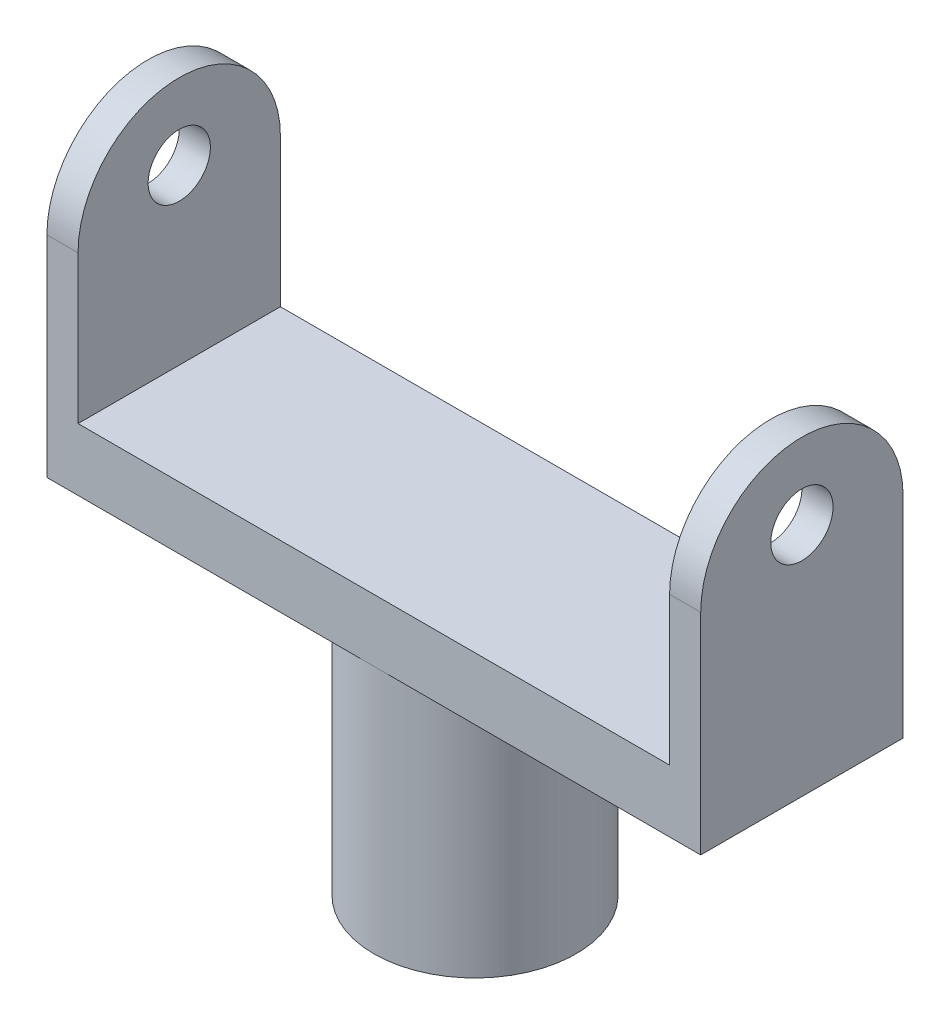
ISO-10303-21;
HEADER;
FILE_DESCRIPTION(('STEP AP214'),'2;1');
FILE_NAME('part.step','',(''),(''),'','','');
FILE_SCHEMA(('AUTOMOTIVE_DESIGN { 1 0 10303 214 1 1 1 1 }'));
ENDSEC;
DATA;
#1=APPLICATION_CONTEXT('core data for automotive mechanical design processes');
#2=APPLICATION_PROTOCOL_DEFINITION('international standard','automotive_design',2000,#1);
#3=PRODUCT_CONTEXT('',#1,'mechanical');
#4=PRODUCT('Part','Part','',(#3));
#5=PRODUCT_RELATED_PRODUCT_CATEGORY('part','',(#4));
#6=PRODUCT_DEFINITION_FORMATION('','',#4);
#7=PRODUCT_DEFINITION_CONTEXT('part definition',#1,'design');
#8=PRODUCT_DEFINITION('design','',#6,#7);
#9=PRODUCT_DEFINITION_SHAPE('','',#8);
#10=(LENGTH_UNIT() NAMED_UNIT(*) SI_UNIT(.MILLI.,.METRE.));
#11=(NAMED_UNIT(*) PLANE_ANGLE_UNIT() SI_UNIT($,.RADIAN.));
#12=(NAMED_UNIT(*) SI_UNIT($,.STERADIAN.) SOLID_ANGLE_UNIT());
#13=UNCERTAINTY_MEASURE_WITH_UNIT(LENGTH_MEASURE(1.E-05),#10,'distance_accuracy_value','');
#14=(GEOMETRIC_REPRESENTATION_CONTEXT(3) GLOBAL_UNCERTAINTY_ASSIGNED_CONTEXT((#13)) GLOBAL_UNIT_ASSIGNED_CONTEXT((#10,
#11,#12)) REPRESENTATION_CONTEXT('',''));
#15=CARTESIAN_POINT('',(0.,0.,0.));
#16=DIRECTION('',(0.,0.,1.));
#17=DIRECTION('',(1.,0.,0.));
#18=AXIS2_PLACEMENT_3D('',#15,#16,#17);
#19=CARTESIAN_POINT('',(-9.5,14.75,0.));
#20=DIRECTION('',(1.,0.,0.));
#21=DIRECTION('',(0.,0.,-1.));
#22=AXIS2_PLACEMENT_3D('',#19,#20,#21);
#23=CYLINDRICAL_SURFACE('',#22,3.25);
#24=DIRECTION('',(-1.,0.,0.));
#25=VECTOR('',#24,1.);
#26=CARTESIAN_POINT('',(-9.5,14.75,3.25));
#27=LINE('',#26,#25);
#28=CARTESIAN_POINT('',(-9.5,14.75,3.25));
#29=VERTEX_POINT('',#28);
#30=CARTESIAN_POINT('',(-10.5,14.75,3.25));
#31=VERTEX_POINT('',#30);
#32=EDGE_CURVE('E200',#29,#31,#27,.T.);
#33=ORIENTED_EDGE('',*,*,#32,.F.);
#34=CARTESIAN_POINT('',(-9.5,14.75,0.));
#35=DIRECTION('',(-1.,0.,0.));
#36=DIRECTION('',(0.,0.,1.));
#37=AXIS2_PLACEMENT_3D('',#34,#35,#36);
#38=CIRCLE('',#37,3.25);
#39=CARTESIAN_POINT('',(-9.5,14.75,-3.25));
#40=VERTEX_POINT('',#39);
#41=EDGE_CURVE('E59',#40,#29,#38,.F.);
#42=ORIENTED_EDGE('',*,*,#41,.F.);
#43=DIRECTION('',(-1.,0.,0.));
#44=VECTOR('',#43,1.);
#45=CARTESIAN_POINT('',(-9.5,14.75,-3.25));
#46=LINE('',#45,#44);
#47=CARTESIAN_POINT('',(-10.5,14.75,-3.25));
#48=VERTEX_POINT('',#47);
#49=EDGE_CURVE('E125',#48,#40,#46,.F.);
#50=ORIENTED_EDGE('',*,*,#49,.F.);
#51=CARTESIAN_POINT('',(-10.5,14.75,0.));
#52=DIRECTION('',(1.,0.,0.));
#53=DIRECTION('',(0.,0.,-1.));
#54=AXIS2_PLACEMENT_3D('',#51,#52,#53);
#55=CIRCLE('',#54,3.25);
#56=EDGE_CURVE('E11',#31,#48,#55,.F.);
#57=ORIENTED_EDGE('',*,*,#56,.F.);
#58=EDGE_LOOP('',(#33,#42,#50,#57));
#59=FACE_BOUND('',#58,.T.);
#60=ADVANCED_FACE('F51',(#59),#23,.T.);
#61=CARTESIAN_POINT('',(10.5,14.75,0.));
#62=DIRECTION('',(1.,0.,0.));
#63=DIRECTION('',(0.,0.,-1.));
#64=AXIS2_PLACEMENT_3D('',#61,#62,#63);
#65=CYLINDRICAL_SURFACE('',#64,3.25);
#66=DIRECTION('',(1.,0.,0.));
#67=VECTOR('',#66,1.);
#68=CARTESIAN_POINT('',(-10.5,14.75,3.25));
#69=LINE('',#68,#67);
#70=CARTESIAN_POINT('',(10.5,14.75,3.25));
#71=VERTEX_POINT('',#70);
#72=CARTESIAN_POINT('',(9.5,14.75,3.25));
#73=VERTEX_POINT('',#72);
#74=EDGE_CURVE('E182',#71,#73,#69,.F.);
#75=ORIENTED_EDGE('',*,*,#74,.F.);
#76=CARTESIAN_POINT('',(10.5,14.75,0.));
#77=DIRECTION('',(-1.,0.,0.));
#78=DIRECTION('',(0.,0.,1.));
#79=AXIS2_PLACEMENT_3D('',#76,#77,#78);
#80=CIRCLE('',#79,3.25);
#81=CARTESIAN_POINT('',(10.5,14.75,-3.25));
#82=VERTEX_POINT('',#81);
#83=EDGE_CURVE('E196',#82,#71,#80,.F.);
#84=ORIENTED_EDGE('',*,*,#83,.F.);
#85=DIRECTION('',(1.,0.,0.));
#86=VECTOR('',#85,1.);
#87=CARTESIAN_POINT('',(-10.5,14.75,-3.25));
#88=LINE('',#87,#86);
#89=CARTESIAN_POINT('',(9.5,14.75,-3.25));
#90=VERTEX_POINT('',#89);
#91=EDGE_CURVE('E193',#90,#82,#88,.T.);
#92=ORIENTED_EDGE('',*,*,#91,.F.);
#93=CARTESIAN_POINT('',(9.5,14.75,0.));
#94=DIRECTION('',(1.,0.,0.));
#95=DIRECTION('',(0.,0.,-1.));
#96=AXIS2_PLACEMENT_3D('',#93,#94,#95);
#97=CIRCLE('',#96,3.25);
#98=EDGE_CURVE('E198',#73,#90,#97,.F.);
#99=ORIENTED_EDGE('',*,*,#98,.F.);
#100=EDGE_LOOP('',(#75,#84,#92,#99));
#101=FACE_BOUND('',#100,.T.);
#102=ADVANCED_FACE('F239',(#101),#65,.T.);
#103=CARTESIAN_POINT('',(0.,10.,0.));
#104=DIRECTION('',(0.,1.,0.));
#105=DIRECTION('',(0.,0.,1.));
#106=AXIS2_PLACEMENT_3D('',#103,#104,#105);
#107=PLANE('',#106);
#108=DIRECTION('',(1.,0.,0.));
#109=VECTOR('',#108,1.);
#110=CARTESIAN_POINT('',(-10.5,10.,3.25));
#111=LINE('',#110,#109);
#112=CARTESIAN_POINT('',(-9.5,10.,3.25));
#113=VERTEX_POINT('',#112);
#114=CARTESIAN_POINT('',(9.5,10.,3.25));
#115=VERTEX_POINT('',#114);
#116=EDGE_CURVE('E139',#113,#115,#111,.T.);
#117=ORIENTED_EDGE('',*,*,#116,.T.);
#118=DIRECTION('',(0.,0.,1.));
#119=VECTOR('',#118,1.);
#120=CARTESIAN_POINT('',(9.5,10.,-3.25));
#121=LINE('',#120,#119);
#122=CARTESIAN_POINT('',(9.5,10.,-3.25));
#123=VERTEX_POINT('',#122);
#124=EDGE_CURVE('E138',#123,#115,#121,.T.);
#125=ORIENTED_EDGE('',*,*,#124,.F.);
#126=DIRECTION('',(-1.,0.,0.));
#127=VECTOR('',#126,1.);
#128=CARTESIAN_POINT('',(-10.5,10.,-3.25));
#129=LINE('',#128,#127);
#130=CARTESIAN_POINT('',(-9.5,10.,-3.25));
#131=VERTEX_POINT('',#130);
#132=EDGE_CURVE('E124',#123,#131,#129,.T.);
#133=ORIENTED_EDGE('',*,*,#132,.T.);
#134=DIRECTION('',(0.,0.,-1.));
#135=VECTOR('',#134,1.);
#136=CARTESIAN_POINT('',(-9.5,10.,-3.25));
#137=LINE('',#136,#135);
#138=EDGE_CURVE('E129',#113,#131,#137,.T.);
#139=ORIENTED_EDGE('',*,*,#138,.F.);
#140=EDGE_LOOP('',(#117,#125,#133,#139));
#141=FACE_BOUND('',#140,.T.);
#142=ADVANCED_FACE('F135',(#141),#107,.T.);
#143=CARTESIAN_POINT('',(0.,0.,0.));
#144=DIRECTION('',(0.,1.,0.));
#145=DIRECTION('',(0.,0.,1.));
#146=AXIS2_PLACEMENT_3D('',#143,#144,#145);
#147=PLANE('',#146);
#148=CARTESIAN_POINT('',(0.,0.,0.));
#149=DIRECTION('',(0.,1.,0.));
#150=DIRECTION('',(0.,0.,1.));
#151=AXIS2_PLACEMENT_3D('',#148,#149,#150);
#152=CIRCLE('',#151,3.25);
#153=CARTESIAN_POINT('',(0.,0.,3.25));
#154=VERTEX_POINT('',#153);
#155=EDGE_CURVE('E178',#154,#154,#152,.T.);
#156=ORIENTED_EDGE('',*,*,#155,.F.);
#157=EDGE_LOOP('',(#156));
#158=FACE_BOUND('',#157,.T.);
#159=CARTESIAN_POINT('',(0.,0.,0.));
#160=DIRECTION('',(0.,1.,0.));
#161=DIRECTION('',(0.,0.,1.));
#162=AXIS2_PLACEMENT_3D('',#159,#160,#161);
#163=CIRCLE('',#162,2.75);
#164=CARTESIAN_POINT('',(0.,0.,2.75));
#165=VERTEX_POINT('',#164);
#166=EDGE_CURVE('E175',#165,#165,#163,.T.);
#167=ORIENTED_EDGE('',*,*,#166,.T.);
#168=EDGE_LOOP('',(#167));
#169=FACE_BOUND('',#168,.T.);
#170=ADVANCED_FACE('F249',(#158,#169),#147,.F.);
#171=CARTESIAN_POINT('',(0.,8.,0.));
#172=DIRECTION('',(0.,-1.,0.));
#173=DIRECTION('',(0.,0.,-1.));
#174=AXIS2_PLACEMENT_3D('',#171,#172,#173);
#175=CYLINDRICAL_SURFACE('',#174,3.25);
#176=CARTESIAN_POINT('',(0.,8.,0.));
#177=DIRECTION('',(0.,1.,0.));
#178=DIRECTION('',(0.,0.,1.));
#179=AXIS2_PLACEMENT_3D('',#176,#177,#178);
#180=CIRCLE('',#179,3.25);
#181=CARTESIAN_POINT('',(0.,8.,3.25));
#182=VERTEX_POINT('',#181);
#183=CARTESIAN_POINT('',(0.,8.,-3.25));
#184=VERTEX_POINT('',#183);
#185=EDGE_CURVE('E179',#182,#184,#180,.T.);
#186=ORIENTED_EDGE('',*,*,#185,.F.);
#187=EDGE_CURVE('E183',#184,#182,#180,.T.);
#188=ORIENTED_EDGE('',*,*,#187,.F.);
#189=EDGE_LOOP('',(#186,#188));
#190=FACE_BOUND('',#189,.T.);
#191=ORIENTED_EDGE('',*,*,#155,.T.);
#192=EDGE_LOOP('',(#191));
#193=FACE_BOUND('',#192,.T.);
#194=ADVANCED_FACE('F256',(#190,#193),#175,.T.);
#195=CARTESIAN_POINT('',(0.,8.,0.));
#196=DIRECTION('',(0.,-1.,0.));
#197=DIRECTION('',(0.,0.,-1.));
#198=AXIS2_PLACEMENT_3D('',#195,#196,#197);
#199=CYLINDRICAL_SURFACE('',#198,2.75);
#200=CARTESIAN_POINT('',(0.,8.,0.));
#201=DIRECTION('',(0.,1.,0.));
#202=DIRECTION('',(0.,0.,1.));
#203=AXIS2_PLACEMENT_3D('',#200,#201,#202);
#204=CIRCLE('',#203,2.75);
#205=CARTESIAN_POINT('',(0.,8.,2.75));
#206=VERTEX_POINT('',#205);
#207=EDGE_CURVE('E172',#206,#206,#204,.T.);
#208=ORIENTED_EDGE('',*,*,#207,.T.);
#209=EDGE_LOOP('',(#208));
#210=FACE_BOUND('',#209,.T.);
#211=ORIENTED_EDGE('',*,*,#166,.F.);
#212=EDGE_LOOP('',(#211));
#213=FACE_BOUND('',#212,.T.);
#214=ADVANCED_FACE('F259',(#210,#213),#199,.F.);
#215=CARTESIAN_POINT('',(0.,8.,0.));
#216=DIRECTION('',(0.,1.,0.));
#217=DIRECTION('',(0.,0.,1.));
#218=AXIS2_PLACEMENT_3D('',#215,#216,#217);
#219=PLANE('',#218);
#220=ORIENTED_EDGE('',*,*,#207,.F.);
#221=EDGE_LOOP('',(#220));
#222=FACE_BOUND('',#221,.T.);
#223=ADVANCED_FACE('F266',(#222),#219,.F.);
#224=DIRECTION('',(1.,0.,0.));
#225=VECTOR('',#224,1.);
#226=CARTESIAN_POINT('',(-10.5,8.,3.25));
#227=LINE('',#226,#225);
#228=CARTESIAN_POINT('',(10.5,8.,3.25));
#229=VERTEX_POINT('',#228);
#230=EDGE_CURVE('E162',#182,#229,#227,.T.);
#231=ORIENTED_EDGE('',*,*,#230,.F.);
#232=ORIENTED_EDGE('',*,*,#185,.T.);
#233=DIRECTION('',(-1.,0.,0.));
#234=VECTOR('',#233,1.);
#235=CARTESIAN_POINT('',(-10.5,8.,-3.25));
#236=LINE('',#235,#234);
#237=CARTESIAN_POINT('',(10.5,8.,-3.25));
#238=VERTEX_POINT('',#237);
#239=EDGE_CURVE('E156',#238,#184,#236,.T.);
#240=ORIENTED_EDGE('',*,*,#239,.F.);
#241=DIRECTION('',(0.,0.,-1.));
#242=VECTOR('',#241,1.);
#243=CARTESIAN_POINT('',(10.5,8.,-3.25));
#244=LINE('',#243,#242);
#245=EDGE_CURVE('E149',#229,#238,#244,.T.);
#246=ORIENTED_EDGE('',*,*,#245,.F.);
#247=EDGE_LOOP('',(#231,#232,#240,#246));
#248=FACE_BOUND('',#247,.T.);
#249=ADVANCED_FACE('F278',(#248),#219,.F.);
#250=CARTESIAN_POINT('',(-10.5,8.,-3.25));
#251=VERTEX_POINT('',#250);
#252=EDGE_CURVE('E155',#184,#251,#236,.T.);
#253=ORIENTED_EDGE('',*,*,#252,.F.);
#254=ORIENTED_EDGE('',*,*,#187,.T.);
#255=CARTESIAN_POINT('',(-10.5,8.,3.25));
#256=VERTEX_POINT('',#255);
#257=EDGE_CURVE('E140',#256,#182,#227,.T.);
#258=ORIENTED_EDGE('',*,*,#257,.F.);
#259=DIRECTION('',(0.,0.,1.));
#260=VECTOR('',#259,1.);
#261=CARTESIAN_POINT('',(-10.5,8.,-3.25));
#262=LINE('',#261,#260);
#263=EDGE_CURVE('E159',#251,#256,#262,.T.);
#264=ORIENTED_EDGE('',*,*,#263,.F.);
#265=EDGE_LOOP('',(#253,#254,#258,#264));
#266=FACE_BOUND('',#265,.T.);
#267=ADVANCED_FACE('F269',(#266),#219,.F.);
#268=CARTESIAN_POINT('',(10.5,10.,-3.25));
#269=DIRECTION('',(-1.,0.,0.));
#270=DIRECTION('',(0.,0.,1.));
#271=AXIS2_PLACEMENT_3D('',#268,#269,#270);
#272=PLANE('',#271);
#273=CARTESIAN_POINT('',(10.5,15.56,0.));
#274=DIRECTION('',(-1.,0.,0.));
#275=DIRECTION('',(0.,0.,1.));
#276=AXIS2_PLACEMENT_3D('',#273,#274,#275);
#277=CIRCLE('',#276,1.);
#278=CARTESIAN_POINT('',(10.5,15.56,1.));
#279=VERTEX_POINT('',#278);
#280=EDGE_CURVE('E190',#279,#279,#277,.T.);
#281=ORIENTED_EDGE('',*,*,#280,.T.);
#282=EDGE_LOOP('',(#281));
#283=FACE_BOUND('',#282,.T.);
#284=DIRECTION('',(0.,-1.,0.));
#285=VECTOR('',#284,1.);
#286=CARTESIAN_POINT('',(10.5,10.,-3.25));
#287=LINE('',#286,#285);
#288=EDGE_CURVE('E170',#82,#238,#287,.T.);
#289=ORIENTED_EDGE('',*,*,#288,.F.);
#290=ORIENTED_EDGE('',*,*,#83,.T.);
#291=DIRECTION('',(0.,-1.,0.));
#292=VECTOR('',#291,1.);
#293=CARTESIAN_POINT('',(10.5,10.,3.25));
#294=LINE('',#293,#292);
#295=EDGE_CURVE('E152',#71,#229,#294,.T.);
#296=ORIENTED_EDGE('',*,*,#295,.T.);
#297=ORIENTED_EDGE('',*,*,#245,.T.);
#298=EDGE_LOOP('',(#289,#290,#296,#297));
#299=FACE_BOUND('',#298,.T.);
#300=ADVANCED_FACE('F220',(#283,#299),#272,.F.);
#301=CARTESIAN_POINT('',(-10.5,10.,-3.25));
#302=DIRECTION('',(0.,0.,1.));
#303=DIRECTION('',(1.,0.,0.));
#304=AXIS2_PLACEMENT_3D('',#301,#302,#303);
#305=PLANE('',#304);
#306=DIRECTION('',(0.,-1.,0.));
#307=VECTOR('',#306,1.);
#308=CARTESIAN_POINT('',(-10.5,10.,-3.25));
#309=LINE('',#308,#307);
#310=EDGE_CURVE('E168',#48,#251,#309,.T.);
#311=ORIENTED_EDGE('',*,*,#310,.F.);
#312=ORIENTED_EDGE('',*,*,#49,.T.);
#313=DIRECTION('',(0.,-1.,0.));
#314=VECTOR('',#313,1.);
#315=CARTESIAN_POINT('',(-9.5,18.,-3.25));
#316=LINE('',#315,#314);
#317=EDGE_CURVE('E119',#40,#131,#316,.T.);
#318=ORIENTED_EDGE('',*,*,#317,.T.);
#319=ORIENTED_EDGE('',*,*,#132,.F.);
#320=DIRECTION('',(0.,-1.,0.));
#321=VECTOR('',#320,1.);
#322=CARTESIAN_POINT('',(9.5,18.,-3.25));
#323=LINE('',#322,#321);
#324=EDGE_CURVE('E208',#90,#123,#323,.T.);
#325=ORIENTED_EDGE('',*,*,#324,.F.);
#326=ORIENTED_EDGE('',*,*,#91,.T.);
#327=ORIENTED_EDGE('',*,*,#288,.T.);
#328=ORIENTED_EDGE('',*,*,#239,.T.);
#329=ORIENTED_EDGE('',*,*,#252,.T.);
#330=EDGE_LOOP('',(#311,#312,#318,#319,#325,#326,#327,#328,#329));
#331=FACE_BOUND('',#330,.T.);
#332=ADVANCED_FACE('F122',(#331),#305,.F.);
#333=CARTESIAN_POINT('',(-10.5,10.,-3.25));
#334=DIRECTION('',(1.,0.,0.));
#335=DIRECTION('',(0.,0.,-1.));
#336=AXIS2_PLACEMENT_3D('',#333,#334,#335);
#337=PLANE('',#336);
#338=CARTESIAN_POINT('',(-10.5,15.56,0.));
#339=DIRECTION('',(-1.,0.,0.));
#340=DIRECTION('',(0.,0.,1.));
#341=AXIS2_PLACEMENT_3D('',#338,#339,#340);
#342=CIRCLE('',#341,1.);
#343=CARTESIAN_POINT('',(-10.5,15.56,1.));
#344=VERTEX_POINT('',#343);
#345=EDGE_CURVE('E214',#344,#344,#342,.T.);
#346=ORIENTED_EDGE('',*,*,#345,.F.);
#347=EDGE_LOOP('',(#346));
#348=FACE_BOUND('',#347,.T.);
#349=DIRECTION('',(0.,-1.,0.));
#350=VECTOR('',#349,1.);
#351=CARTESIAN_POINT('',(-10.5,10.,3.25));
#352=LINE('',#351,#350);
#353=EDGE_CURVE('E166',#31,#256,#352,.T.);
#354=ORIENTED_EDGE('',*,*,#353,.F.);
#355=ORIENTED_EDGE('',*,*,#56,.T.);
#356=ORIENTED_EDGE('',*,*,#310,.T.);
#357=ORIENTED_EDGE('',*,*,#263,.T.);
#358=EDGE_LOOP('',(#354,#355,#356,#357));
#359=FACE_BOUND('',#358,.T.);
#360=ADVANCED_FACE('F271',(#348,#359),#337,.F.);
#361=CARTESIAN_POINT('',(-10.5,10.,3.25));
#362=DIRECTION('',(0.,0.,-1.));
#363=DIRECTION('',(-1.,0.,0.));
#364=AXIS2_PLACEMENT_3D('',#361,#362,#363);
#365=PLANE('',#364);
#366=DIRECTION('',(0.,-1.,0.));
#367=VECTOR('',#366,1.);
#368=CARTESIAN_POINT('',(-9.5,18.,3.25));
#369=LINE('',#368,#367);
#370=EDGE_CURVE('E128',#29,#113,#369,.T.);
#371=ORIENTED_EDGE('',*,*,#370,.F.);
#372=ORIENTED_EDGE('',*,*,#32,.T.);
#373=ORIENTED_EDGE('',*,*,#353,.T.);
#374=ORIENTED_EDGE('',*,*,#257,.T.);
#375=ORIENTED_EDGE('',*,*,#230,.T.);
#376=ORIENTED_EDGE('',*,*,#295,.F.);
#377=ORIENTED_EDGE('',*,*,#74,.T.);
#378=DIRECTION('',(0.,-1.,0.));
#379=VECTOR('',#378,1.);
#380=CARTESIAN_POINT('',(9.5,18.,3.25));
#381=LINE('',#380,#379);
#382=EDGE_CURVE('E145',#73,#115,#381,.T.);
#383=ORIENTED_EDGE('',*,*,#382,.T.);
#384=ORIENTED_EDGE('',*,*,#116,.F.);
#385=EDGE_LOOP('',(#371,#372,#373,#374,#375,#376,#377,#383,#384));
#386=FACE_BOUND('',#385,.T.);
#387=ADVANCED_FACE('F204',(#386),#365,.F.);
#388=CARTESIAN_POINT('',(-9.5,18.,-3.25));
#389=DIRECTION('',(-1.,0.,0.));
#390=DIRECTION('',(0.,0.,1.));
#391=AXIS2_PLACEMENT_3D('',#388,#389,#390);
#392=PLANE('',#391);
#393=CARTESIAN_POINT('',(-9.5,15.56,0.));
#394=DIRECTION('',(-1.,0.,0.));
#395=DIRECTION('',(0.,0.,1.));
#396=AXIS2_PLACEMENT_3D('',#393,#394,#395);
#397=CIRCLE('',#396,1.);
#398=CARTESIAN_POINT('',(-9.5,15.56,1.));
#399=VERTEX_POINT('',#398);
#400=EDGE_CURVE('E189',#399,#399,#397,.T.);
#401=ORIENTED_EDGE('',*,*,#400,.T.);
#402=EDGE_LOOP('',(#401));
#403=FACE_BOUND('',#402,.T.);
#404=ORIENTED_EDGE('',*,*,#317,.F.);
#405=ORIENTED_EDGE('',*,*,#41,.T.);
#406=ORIENTED_EDGE('',*,*,#370,.T.);
#407=ORIENTED_EDGE('',*,*,#138,.T.);
#408=EDGE_LOOP('',(#404,#405,#406,#407));
#409=FACE_BOUND('',#408,.T.);
#410=ADVANCED_FACE('F142',(#403,#409),#392,.F.);
#411=CARTESIAN_POINT('',(9.5,18.,-3.25));
#412=DIRECTION('',(1.,0.,0.));
#413=DIRECTION('',(0.,0.,-1.));
#414=AXIS2_PLACEMENT_3D('',#411,#412,#413);
#415=PLANE('',#414);
#416=CARTESIAN_POINT('',(9.5,15.56,0.));
#417=DIRECTION('',(1.,0.,0.));
#418=DIRECTION('',(0.,0.,-1.));
#419=AXIS2_PLACEMENT_3D('',#416,#417,#418);
#420=CIRCLE('',#419,1.);
#421=CARTESIAN_POINT('',(9.5,15.56,1.));
#422=VERTEX_POINT('',#421);
#423=EDGE_CURVE('E186',#422,#422,#420,.T.);
#424=ORIENTED_EDGE('',*,*,#423,.T.);
#425=EDGE_LOOP('',(#424));
#426=FACE_BOUND('',#425,.T.);
#427=ORIENTED_EDGE('',*,*,#382,.F.);
#428=ORIENTED_EDGE('',*,*,#98,.T.);
#429=ORIENTED_EDGE('',*,*,#324,.T.);
#430=ORIENTED_EDGE('',*,*,#124,.T.);
#431=EDGE_LOOP('',(#427,#428,#429,#430));
#432=FACE_BOUND('',#431,.T.);
#433=ADVANCED_FACE('F207',(#426,#432),#415,.F.);
#434=CARTESIAN_POINT('',(10.5,15.56,0.));
#435=DIRECTION('',(-1.,0.,0.));
#436=DIRECTION('',(0.,0.,1.));
#437=AXIS2_PLACEMENT_3D('',#434,#435,#436);
#438=CYLINDRICAL_SURFACE('',#437,1.);
#439=CARTESIAN_POINT('',(10.5,15.56,1.));
#440=CARTESIAN_POINT('',(10.4895833333333,15.56,1.));
#441=CARTESIAN_POINT('',(10.4791666666667,15.56,1.));
#442=CARTESIAN_POINT('',(10.4583333333333,15.56,1.));
#443=CARTESIAN_POINT('',(10.4479166666667,15.56,1.));
#444=CARTESIAN_POINT('',(10.4270833333333,15.56,1.));
#445=CARTESIAN_POINT('',(10.4166666666667,15.56,1.));
#446=CARTESIAN_POINT('',(10.3958333333333,15.56,1.));
#447=CARTESIAN_POINT('',(10.3854166666667,15.56,1.));
#448=CARTESIAN_POINT('',(10.3645833333333,15.56,1.));
#449=CARTESIAN_POINT('',(10.3541666666667,15.56,1.));
#450=CARTESIAN_POINT('',(10.3333333333333,15.56,1.));
#451=CARTESIAN_POINT('',(10.3229166666667,15.56,1.));
#452=CARTESIAN_POINT('',(10.3020833333333,15.56,1.));
#453=CARTESIAN_POINT('',(10.2916666666667,15.56,1.));
#454=CARTESIAN_POINT('',(10.2708333333333,15.56,1.));
#455=CARTESIAN_POINT('',(10.2604166666667,15.56,1.));
#456=CARTESIAN_POINT('',(10.2395833333333,15.56,1.));
#457=CARTESIAN_POINT('',(10.2291666666667,15.56,1.));
#458=CARTESIAN_POINT('',(10.2083333333333,15.56,1.));
#459=CARTESIAN_POINT('',(10.1979166666667,15.56,1.));
#460=CARTESIAN_POINT('',(10.1770833333333,15.56,1.));
#461=CARTESIAN_POINT('',(10.1666666666667,15.56,1.));
#462=CARTESIAN_POINT('',(10.1458333333333,15.56,1.));
#463=CARTESIAN_POINT('',(10.1354166666667,15.56,1.));
#464=CARTESIAN_POINT('',(10.1145833333333,15.56,1.));
#465=CARTESIAN_POINT('',(10.1041666666667,15.56,1.));
#466=CARTESIAN_POINT('',(10.0833333333333,15.56,1.));
#467=CARTESIAN_POINT('',(10.0729166666667,15.56,1.));
#468=CARTESIAN_POINT('',(10.0520833333333,15.56,1.));
#469=CARTESIAN_POINT('',(10.0416666666667,15.56,1.));
#470=CARTESIAN_POINT('',(10.0208333333333,15.56,1.));
#471=CARTESIAN_POINT('',(10.0104166666667,15.56,1.));
#472=CARTESIAN_POINT('',(9.98958333333333,15.56,1.));
#473=CARTESIAN_POINT('',(9.97916666666667,15.56,1.));
#474=CARTESIAN_POINT('',(9.95833333333333,15.56,1.));
#475=CARTESIAN_POINT('',(9.94791666666667,15.56,1.));
#476=CARTESIAN_POINT('',(9.92708333333333,15.56,1.));
#477=CARTESIAN_POINT('',(9.91666666666667,15.56,1.));
#478=CARTESIAN_POINT('',(9.89583333333333,15.56,1.));
#479=CARTESIAN_POINT('',(9.88541666666667,15.56,1.));
#480=CARTESIAN_POINT('',(9.86458333333333,15.56,1.));
#481=CARTESIAN_POINT('',(9.85416666666667,15.56,1.));
#482=CARTESIAN_POINT('',(9.83333333333333,15.56,1.));
#483=CARTESIAN_POINT('',(9.82291666666667,15.56,1.));
#484=CARTESIAN_POINT('',(9.80208333333333,15.56,1.));
#485=CARTESIAN_POINT('',(9.79166666666667,15.56,1.));
#486=CARTESIAN_POINT('',(9.77083333333333,15.56,1.));
#487=CARTESIAN_POINT('',(9.76041666666667,15.56,1.));
#488=CARTESIAN_POINT('',(9.73958333333333,15.56,1.));
#489=CARTESIAN_POINT('',(9.72916666666667,15.56,1.));
#490=CARTESIAN_POINT('',(9.70833333333333,15.56,1.));
#491=CARTESIAN_POINT('',(9.69791666666667,15.56,1.));
#492=CARTESIAN_POINT('',(9.67708333333333,15.56,1.));
#493=CARTESIAN_POINT('',(9.66666666666667,15.56,1.));
#494=CARTESIAN_POINT('',(9.64583333333333,15.56,1.));
#495=CARTESIAN_POINT('',(9.63541666666667,15.56,1.));
#496=CARTESIAN_POINT('',(9.61458333333333,15.56,1.));
#497=CARTESIAN_POINT('',(9.60416666666667,15.56,1.));
#498=CARTESIAN_POINT('',(9.58333333333333,15.56,1.));
#499=CARTESIAN_POINT('',(9.57291666666667,15.56,1.));
#500=CARTESIAN_POINT('',(9.55208333333333,15.56,1.));
#501=CARTESIAN_POINT('',(9.54166666666667,15.56,1.));
#502=CARTESIAN_POINT('',(9.52083333333333,15.56,1.));
#503=CARTESIAN_POINT('',(9.51041666666667,15.56,1.));
#504=CARTESIAN_POINT('',(9.5,15.56,1.));
#505=B_SPLINE_CURVE_WITH_KNOTS('',3,(#439,#440,#441,#442,#443,#444,#445,#446,#447,#448,#449,
#450,#451,#452,#453,#454,#455,#456,#457,#458,#459,#460,#461,#462,#463,#464,#465,#466,#467,#468,
#469,#470,#471,#472,#473,#474,#475,#476,#477,#478,#479,#480,#481,#482,#483,#484,#485,#486,#487,
#488,#489,#490,#491,#492,#493,#494,#495,#496,#497,#498,#499,#500,#501,#502,#503,#504),
.UNSPECIFIED.,.F.,.F.,(4,2,2,2,2,2,2,2,2,2,2,2,2,2,2,2,2,2,2,2,2,2,2,2,2,2,2,2,2,2,2,2,4),(0.,
0.0312500000000018,0.0625000000000018,0.0937500000000018,0.125000000000002,0.156250000000002,
0.187500000000002,0.218750000000002,0.250000000000002,0.281250000000002,0.312500000000002,
0.343750000000002,0.375000000000002,0.406250000000002,0.437500000000002,0.468750000000002,
0.500000000000002,0.531250000000002,0.562500000000002,0.593750000000002,0.625000000000002,
0.656250000000002,0.687500000000002,0.718750000000002,0.750000000000002,0.781250000000002,
0.812500000000002,0.843750000000002,0.875000000000004,0.906250000000004,0.937500000000004,
0.968750000000004,1.),.UNSPECIFIED.);
#506=EDGE_CURVE('BSEAM223',#279,#422,#505,.T.);
#507=ORIENTED_EDGE('',*,*,#280,.F.);
#508=ORIENTED_EDGE('',*,*,#423,.F.);
#509=ORIENTED_EDGE('',*,*,#506,.T.);
#510=ORIENTED_EDGE('',*,*,#506,.F.);
#511=EDGE_LOOP('',(#507,#509,#508,#510));
#512=FACE_BOUND('',#511,.T.);
#513=ADVANCED_FACE('F223',(#512),#438,.F.);
#514=CARTESIAN_POINT('',(-10.5,15.56,1.));
#515=CARTESIAN_POINT('',(-10.4895833333333,15.56,1.));
#516=CARTESIAN_POINT('',(-10.4791666666667,15.56,1.));
#517=CARTESIAN_POINT('',(-10.4583333333333,15.56,1.));
#518=CARTESIAN_POINT('',(-10.4479166666667,15.56,1.));
#519=CARTESIAN_POINT('',(-10.4270833333333,15.56,1.));
#520=CARTESIAN_POINT('',(-10.4166666666667,15.56,1.));
#521=CARTESIAN_POINT('',(-10.3958333333333,15.56,1.));
#522=CARTESIAN_POINT('',(-10.3854166666667,15.56,1.));
#523=CARTESIAN_POINT('',(-10.3645833333333,15.56,1.));
#524=CARTESIAN_POINT('',(-10.3541666666667,15.56,1.));
#525=CARTESIAN_POINT('',(-10.3333333333333,15.56,1.));
#526=CARTESIAN_POINT('',(-10.3229166666667,15.56,1.));
#527=CARTESIAN_POINT('',(-10.3020833333333,15.56,1.));
#528=CARTESIAN_POINT('',(-10.2916666666667,15.56,1.));
#529=CARTESIAN_POINT('',(-10.2708333333333,15.56,1.));
#530=CARTESIAN_POINT('',(-10.2604166666667,15.56,1.));
#531=CARTESIAN_POINT('',(-10.2395833333333,15.56,1.));
#532=CARTESIAN_POINT('',(-10.2291666666667,15.56,1.));
#533=CARTESIAN_POINT('',(-10.2083333333333,15.56,1.));
#534=CARTESIAN_POINT('',(-10.1979166666667,15.56,1.));
#535=CARTESIAN_POINT('',(-10.1770833333333,15.56,1.));
#536=CARTESIAN_POINT('',(-10.1666666666667,15.56,1.));
#537=CARTESIAN_POINT('',(-10.1458333333333,15.56,1.));
#538=CARTESIAN_POINT('',(-10.1354166666667,15.56,1.));
#539=CARTESIAN_POINT('',(-10.1145833333333,15.56,1.));
#540=CARTESIAN_POINT('',(-10.1041666666667,15.56,1.));
#541=CARTESIAN_POINT('',(-10.0833333333333,15.56,1.));
#542=CARTESIAN_POINT('',(-10.0729166666667,15.56,1.));
#543=CARTESIAN_POINT('',(-10.0520833333333,15.56,1.));
#544=CARTESIAN_POINT('',(-10.0416666666667,15.56,1.));
#545=CARTESIAN_POINT('',(-10.0208333333333,15.56,1.));
#546=CARTESIAN_POINT('',(-10.0104166666667,15.56,1.));
#547=CARTESIAN_POINT('',(-9.98958333333333,15.56,1.));
#548=CARTESIAN_POINT('',(-9.97916666666667,15.56,1.));
#549=CARTESIAN_POINT('',(-9.95833333333333,15.56,1.));
#550=CARTESIAN_POINT('',(-9.94791666666667,15.56,1.));
#551=CARTESIAN_POINT('',(-9.92708333333333,15.56,1.));
#552=CARTESIAN_POINT('',(-9.91666666666667,15.56,1.));
#553=CARTESIAN_POINT('',(-9.89583333333333,15.56,1.));
#554=CARTESIAN_POINT('',(-9.88541666666667,15.56,1.));
#555=CARTESIAN_POINT('',(-9.86458333333333,15.56,1.));
#556=CARTESIAN_POINT('',(-9.85416666666667,15.56,1.));
#557=CARTESIAN_POINT('',(-9.83333333333333,15.56,1.));
#558=CARTESIAN_POINT('',(-9.82291666666667,15.56,1.));
#559=CARTESIAN_POINT('',(-9.80208333333333,15.56,1.));
#560=CARTESIAN_POINT('',(-9.79166666666667,15.56,1.));
#561=CARTESIAN_POINT('',(-9.77083333333333,15.56,1.));
#562=CARTESIAN_POINT('',(-9.76041666666667,15.56,1.));
#563=CARTESIAN_POINT('',(-9.73958333333333,15.56,1.));
#564=CARTESIAN_POINT('',(-9.72916666666667,15.56,1.));
#565=CARTESIAN_POINT('',(-9.70833333333333,15.56,1.));
#566=CARTESIAN_POINT('',(-9.69791666666667,15.56,1.));
#567=CARTESIAN_POINT('',(-9.67708333333333,15.56,1.));
#568=CARTESIAN_POINT('',(-9.66666666666667,15.56,1.));
#569=CARTESIAN_POINT('',(-9.64583333333333,15.56,1.));
#570=CARTESIAN_POINT('',(-9.63541666666667,15.56,1.));
#571=CARTESIAN_POINT('',(-9.61458333333333,15.56,1.));
#572=CARTESIAN_POINT('',(-9.60416666666667,15.56,1.));
#573=CARTESIAN_POINT('',(-9.58333333333333,15.56,1.));
#574=CARTESIAN_POINT('',(-9.57291666666667,15.56,1.));
#575=CARTESIAN_POINT('',(-9.55208333333333,15.56,1.));
#576=CARTESIAN_POINT('',(-9.54166666666667,15.56,1.));
#577=CARTESIAN_POINT('',(-9.52083333333333,15.56,1.));
#578=CARTESIAN_POINT('',(-9.51041666666667,15.56,1.));
#579=CARTESIAN_POINT('',(-9.5,15.56,1.));
#580=B_SPLINE_CURVE_WITH_KNOTS('',3,(#514,#515,#516,#517,#518,#519,#520,#521,#522,#523,#524,
#525,#526,#527,#528,#529,#530,#531,#532,#533,#534,#535,#536,#537,#538,#539,#540,#541,#542,#543,
#544,#545,#546,#547,#548,#549,#550,#551,#552,#553,#554,#555,#556,#557,#558,#559,#560,#561,#562,
#563,#564,#565,#566,#567,#568,#569,#570,#571,#572,#573,#574,#575,#576,#577,#578,#579),
.UNSPECIFIED.,.F.,.F.,(4,2,2,2,2,2,2,2,2,2,2,2,2,2,2,2,2,2,2,2,2,2,2,2,2,2,2,2,2,2,2,2,4),(0.,
0.03125,0.0625000000000001,0.0937500000000001,0.125,0.15625,0.1875,0.21875,0.25,0.28125,0.3125,
0.34375,0.375,0.40625,0.4375,0.46875,0.5,0.53125,0.5625,0.593750000000001,0.625000000000001,
0.656250000000001,0.687500000000001,0.718750000000001,0.750000000000001,0.781250000000001,
0.812500000000001,0.843750000000001,0.875000000000001,0.906250000000001,0.937500000000001,
0.968750000000001,1.),.UNSPECIFIED.);
#581=EDGE_CURVE('BSEAM226',#344,#399,#580,.T.);
#582=ORIENTED_EDGE('',*,*,#345,.T.);
#583=ORIENTED_EDGE('',*,*,#400,.F.);
#584=ORIENTED_EDGE('',*,*,#581,.T.);
#585=ORIENTED_EDGE('',*,*,#581,.F.);
#586=EDGE_LOOP('',(#582,#584,#583,#585));
#587=FACE_BOUND('',#586,.T.);
#588=ADVANCED_FACE('F226',(#587),#438,.F.);
#589=CLOSED_SHELL('',(#60,#102,#142,#170,#194,#214,#223,#249,#267,#300,#332,#360,#387,#410,#433,
#513,#588));
#590=MANIFOLD_SOLID_BREP('B2',#589);
#591=ADVANCED_BREP_SHAPE_REPRESENTATION('',(#18,#590),#14);
#592=SHAPE_DEFINITION_REPRESENTATION(#9,#591);
ENDSEC;
END-ISO-10303-21;
